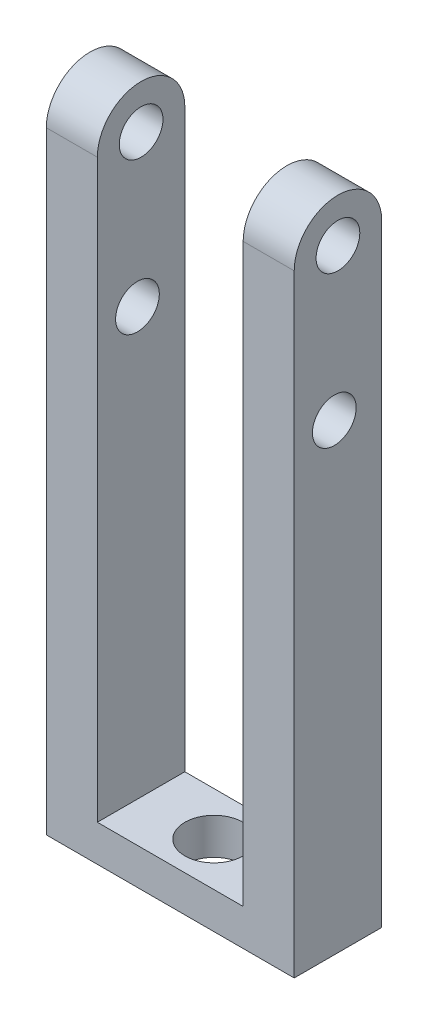
ISO-10303-21;
HEADER;
FILE_DESCRIPTION(('STEP AP214'),'2;1');
FILE_NAME('part.step','',(''),(''),'','','');
FILE_SCHEMA(('AUTOMOTIVE_DESIGN { 1 0 10303 214 1 1 1 1 }'));
ENDSEC;
DATA;
#1=APPLICATION_CONTEXT('core data for automotive mechanical design processes');
#2=APPLICATION_PROTOCOL_DEFINITION('international standard','automotive_design',2000,#1);
#3=PRODUCT_CONTEXT('',#1,'mechanical');
#4=PRODUCT('Part','Part','',(#3));
#5=PRODUCT_RELATED_PRODUCT_CATEGORY('part','',(#4));
#6=PRODUCT_DEFINITION_FORMATION('','',#4);
#7=PRODUCT_DEFINITION_CONTEXT('part definition',#1,'design');
#8=PRODUCT_DEFINITION('design','',#6,#7);
#9=PRODUCT_DEFINITION_SHAPE('','',#8);
#10=(LENGTH_UNIT() NAMED_UNIT(*) SI_UNIT(.MILLI.,.METRE.));
#11=(NAMED_UNIT(*) PLANE_ANGLE_UNIT() SI_UNIT($,.RADIAN.));
#12=(NAMED_UNIT(*) SI_UNIT($,.STERADIAN.) SOLID_ANGLE_UNIT());
#13=UNCERTAINTY_MEASURE_WITH_UNIT(LENGTH_MEASURE(1.E-05),#10,'distance_accuracy_value','');
#14=(GEOMETRIC_REPRESENTATION_CONTEXT(3) GLOBAL_UNCERTAINTY_ASSIGNED_CONTEXT((#13)) GLOBAL_UNIT_ASSIGNED_CONTEXT((#10,
#11,#12)) REPRESENTATION_CONTEXT('',''));
#15=CARTESIAN_POINT('',(0.,0.,0.));
#16=DIRECTION('',(0.,0.,1.));
#17=DIRECTION('',(1.,0.,0.));
#18=AXIS2_PLACEMENT_3D('',#15,#16,#17);
#19=CARTESIAN_POINT('',(17.,5.,6.));
#20=DIRECTION('',(-1.,0.,0.));
#21=DIRECTION('',(0.,0.,1.));
#22=AXIS2_PLACEMENT_3D('',#19,#20,#21);
#23=PLANE('',#22);
#24=DIRECTION('',(0.,0.,-1.));
#25=VECTOR('',#24,1.);
#26=CARTESIAN_POINT('',(17.,0.,6.));
#27=LINE('',#26,#25);
#28=CARTESIAN_POINT('',(17.,0.,6.));
#29=VERTEX_POINT('',#28);
#30=CARTESIAN_POINT('',(17.,0.,-6.));
#31=VERTEX_POINT('',#30);
#32=EDGE_CURVE('E192',#29,#31,#27,.T.);
#33=ORIENTED_EDGE('',*,*,#32,.T.);
#34=DIRECTION('',(0.,-1.,0.));
#35=VECTOR('',#34,1.);
#36=CARTESIAN_POINT('',(17.,5.,-6.));
#37=LINE('',#36,#35);
#38=CARTESIAN_POINT('',(17.,84.,-6.));
#39=VERTEX_POINT('',#38);
#40=EDGE_CURVE('E11',#39,#31,#37,.T.);
#41=ORIENTED_EDGE('',*,*,#40,.F.);
#42=CARTESIAN_POINT('',(17.,84.,0.));
#43=DIRECTION('',(1.,0.,0.));
#44=DIRECTION('',(0.,0.,1.));
#45=AXIS2_PLACEMENT_3D('',#42,#43,#44);
#46=CIRCLE('',#45,6.);
#47=CARTESIAN_POINT('',(17.,84.,6.));
#48=VERTEX_POINT('',#47);
#49=EDGE_CURVE('E166',#39,#48,#46,.T.);
#50=ORIENTED_EDGE('',*,*,#49,.T.);
#51=DIRECTION('',(0.,-1.,0.));
#52=VECTOR('',#51,1.);
#53=CARTESIAN_POINT('',(17.,5.,6.));
#54=LINE('',#53,#52);
#55=EDGE_CURVE('E201',#48,#29,#54,.T.);
#56=ORIENTED_EDGE('',*,*,#55,.T.);
#57=EDGE_LOOP('',(#33,#41,#50,#56));
#58=FACE_BOUND('',#57,.T.);
#59=CARTESIAN_POINT('',(17.,63.5,0.5));
#60=DIRECTION('',(1.,0.,0.));
#61=DIRECTION('',(0.,0.,-1.));
#62=AXIS2_PLACEMENT_3D('',#59,#60,#61);
#63=CIRCLE('',#62,3.);
#64=CARTESIAN_POINT('',(17.,63.5,-2.5));
#65=VERTEX_POINT('',#64);
#66=EDGE_CURVE('E150',#65,#65,#63,.T.);
#67=ORIENTED_EDGE('',*,*,#66,.F.);
#68=EDGE_LOOP('',(#67));
#69=FACE_BOUND('',#68,.T.);
#70=CARTESIAN_POINT('',(17.,84.,0.));
#71=DIRECTION('',(1.,0.,0.));
#72=DIRECTION('',(0.,0.,-1.));
#73=AXIS2_PLACEMENT_3D('',#70,#71,#72);
#74=CIRCLE('',#73,3.);
#75=CARTESIAN_POINT('',(17.,84.,-3.00000000000001));
#76=VERTEX_POINT('',#75);
#77=EDGE_CURVE('E158',#76,#76,#74,.T.);
#78=ORIENTED_EDGE('',*,*,#77,.F.);
#79=EDGE_LOOP('',(#78));
#80=FACE_BOUND('',#79,.T.);
#81=ADVANCED_FACE('F39',(#58,#69,#80),#23,.F.);
#82=CARTESIAN_POINT('',(-17.,5.,-6.));
#83=DIRECTION('',(0.,0.,1.));
#84=DIRECTION('',(1.,0.,0.));
#85=AXIS2_PLACEMENT_3D('',#82,#83,#84);
#86=PLANE('',#85);
#87=DIRECTION('',(-1.,0.,0.));
#88=VECTOR('',#87,1.);
#89=CARTESIAN_POINT('',(-17.,0.,-6.));
#90=LINE('',#89,#88);
#91=CARTESIAN_POINT('',(-17.,0.,-6.));
#92=VERTEX_POINT('',#91);
#93=EDGE_CURVE('E205',#31,#92,#90,.T.);
#94=ORIENTED_EDGE('',*,*,#93,.T.);
#95=DIRECTION('',(0.,-1.,0.));
#96=VECTOR('',#95,1.);
#97=CARTESIAN_POINT('',(-17.,5.,-6.));
#98=LINE('',#97,#96);
#99=CARTESIAN_POINT('',(-17.,84.,-6.));
#100=VERTEX_POINT('',#99);
#101=EDGE_CURVE('E47',#100,#92,#98,.T.);
#102=ORIENTED_EDGE('',*,*,#101,.F.);
#103=DIRECTION('',(-1.,0.,0.));
#104=VECTOR('',#103,1.);
#105=CARTESIAN_POINT('',(-10.,84.,-6.));
#106=LINE('',#105,#104);
#107=CARTESIAN_POINT('',(-10.,84.,-6.));
#108=VERTEX_POINT('',#107);
#109=EDGE_CURVE('E125',#108,#100,#106,.T.);
#110=ORIENTED_EDGE('',*,*,#109,.F.);
#111=DIRECTION('',(0.,1.,0.));
#112=VECTOR('',#111,1.);
#113=CARTESIAN_POINT('',(-10.,5.,-6.));
#114=LINE('',#113,#112);
#115=CARTESIAN_POINT('',(-10.,5.,-6.));
#116=VERTEX_POINT('',#115);
#117=EDGE_CURVE('E110',#116,#108,#114,.T.);
#118=ORIENTED_EDGE('',*,*,#117,.F.);
#119=DIRECTION('',(-1.,0.,0.));
#120=VECTOR('',#119,1.);
#121=CARTESIAN_POINT('',(-17.,5.,-6.));
#122=LINE('',#121,#120);
#123=CARTESIAN_POINT('',(10.,5.,-6.));
#124=VERTEX_POINT('',#123);
#125=EDGE_CURVE('E54',#124,#116,#122,.T.);
#126=ORIENTED_EDGE('',*,*,#125,.F.);
#127=DIRECTION('',(0.,1.,0.));
#128=VECTOR('',#127,1.);
#129=CARTESIAN_POINT('',(10.,5.,-6.));
#130=LINE('',#129,#128);
#131=CARTESIAN_POINT('',(10.,84.,-6.));
#132=VERTEX_POINT('',#131);
#133=EDGE_CURVE('E176',#124,#132,#130,.T.);
#134=ORIENTED_EDGE('',*,*,#133,.T.);
#135=DIRECTION('',(1.,0.,0.));
#136=VECTOR('',#135,1.);
#137=CARTESIAN_POINT('',(10.,84.,-6.));
#138=LINE('',#137,#136);
#139=EDGE_CURVE('E184',#132,#39,#138,.T.);
#140=ORIENTED_EDGE('',*,*,#139,.T.);
#141=ORIENTED_EDGE('',*,*,#40,.T.);
#142=EDGE_LOOP('',(#94,#102,#110,#118,#126,#134,#140,#141));
#143=FACE_BOUND('',#142,.T.);
#144=ADVANCED_FACE('F240',(#143),#86,.F.);
#145=CARTESIAN_POINT('',(-17.,5.,6.));
#146=DIRECTION('',(1.,0.,0.));
#147=DIRECTION('',(0.,0.,-1.));
#148=AXIS2_PLACEMENT_3D('',#145,#146,#147);
#149=PLANE('',#148);
#150=DIRECTION('',(0.,0.,1.));
#151=VECTOR('',#150,1.);
#152=CARTESIAN_POINT('',(-17.,0.,6.));
#153=LINE('',#152,#151);
#154=CARTESIAN_POINT('',(-17.,0.,6.));
#155=VERTEX_POINT('',#154);
#156=EDGE_CURVE('E208',#92,#155,#153,.T.);
#157=ORIENTED_EDGE('',*,*,#156,.T.);
#158=DIRECTION('',(0.,-1.,0.));
#159=VECTOR('',#158,1.);
#160=CARTESIAN_POINT('',(-17.,5.,6.));
#161=LINE('',#160,#159);
#162=CARTESIAN_POINT('',(-17.,84.,6.));
#163=VERTEX_POINT('',#162);
#164=EDGE_CURVE('E216',#163,#155,#161,.T.);
#165=ORIENTED_EDGE('',*,*,#164,.F.);
#166=CARTESIAN_POINT('',(-17.,84.,0.));
#167=DIRECTION('',(1.,0.,0.));
#168=DIRECTION('',(0.,0.,1.));
#169=AXIS2_PLACEMENT_3D('',#166,#167,#168);
#170=CIRCLE('',#169,6.);
#171=EDGE_CURVE('E121',#100,#163,#170,.T.);
#172=ORIENTED_EDGE('',*,*,#171,.F.);
#173=ORIENTED_EDGE('',*,*,#101,.T.);
#174=EDGE_LOOP('',(#157,#165,#172,#173));
#175=FACE_BOUND('',#174,.T.);
#176=CARTESIAN_POINT('',(-17.,84.,0.));
#177=DIRECTION('',(1.,0.,0.));
#178=DIRECTION('',(0.,0.,-1.));
#179=AXIS2_PLACEMENT_3D('',#176,#177,#178);
#180=CIRCLE('',#179,3.);
#181=CARTESIAN_POINT('',(-17.,84.,-3.00000000000001));
#182=VERTEX_POINT('',#181);
#183=EDGE_CURVE('E136',#182,#182,#180,.T.);
#184=ORIENTED_EDGE('',*,*,#183,.T.);
#185=EDGE_LOOP('',(#184));
#186=FACE_BOUND('',#185,.T.);
#187=CARTESIAN_POINT('',(-17.,63.5,0.5));
#188=DIRECTION('',(1.,0.,0.));
#189=DIRECTION('',(0.,0.,-1.));
#190=AXIS2_PLACEMENT_3D('',#187,#188,#189);
#191=CIRCLE('',#190,3.);
#192=CARTESIAN_POINT('',(-17.,63.5,-2.5));
#193=VERTEX_POINT('',#192);
#194=EDGE_CURVE('E293',#193,#193,#191,.T.);
#195=ORIENTED_EDGE('',*,*,#194,.T.);
#196=EDGE_LOOP('',(#195));
#197=FACE_BOUND('',#196,.T.);
#198=ADVANCED_FACE('F222',(#175,#186,#197),#149,.F.);
#199=CARTESIAN_POINT('',(-17.,5.,6.));
#200=DIRECTION('',(0.,0.,-1.));
#201=DIRECTION('',(-1.,0.,0.));
#202=AXIS2_PLACEMENT_3D('',#199,#200,#201);
#203=PLANE('',#202);
#204=DIRECTION('',(1.,0.,0.));
#205=VECTOR('',#204,1.);
#206=CARTESIAN_POINT('',(-17.,0.,6.));
#207=LINE('',#206,#205);
#208=EDGE_CURVE('E198',#155,#29,#207,.T.);
#209=ORIENTED_EDGE('',*,*,#208,.T.);
#210=ORIENTED_EDGE('',*,*,#55,.F.);
#211=DIRECTION('',(1.,0.,0.));
#212=VECTOR('',#211,1.);
#213=CARTESIAN_POINT('',(10.,84.,6.));
#214=LINE('',#213,#212);
#215=CARTESIAN_POINT('',(10.,84.,6.));
#216=VERTEX_POINT('',#215);
#217=EDGE_CURVE('E188',#216,#48,#214,.T.);
#218=ORIENTED_EDGE('',*,*,#217,.F.);
#219=DIRECTION('',(0.,-1.,0.));
#220=VECTOR('',#219,1.);
#221=CARTESIAN_POINT('',(10.,5.,6.));
#222=LINE('',#221,#220);
#223=CARTESIAN_POINT('',(10.,5.,6.));
#224=VERTEX_POINT('',#223);
#225=EDGE_CURVE('E170',#216,#224,#222,.T.);
#226=ORIENTED_EDGE('',*,*,#225,.T.);
#227=DIRECTION('',(1.,0.,0.));
#228=VECTOR('',#227,1.);
#229=CARTESIAN_POINT('',(-17.,5.,6.));
#230=LINE('',#229,#228);
#231=CARTESIAN_POINT('',(-10.,5.,6.));
#232=VERTEX_POINT('',#231);
#233=EDGE_CURVE('E129',#232,#224,#230,.T.);
#234=ORIENTED_EDGE('',*,*,#233,.F.);
#235=DIRECTION('',(0.,-1.,0.));
#236=VECTOR('',#235,1.);
#237=CARTESIAN_POINT('',(-10.,5.,6.));
#238=LINE('',#237,#236);
#239=CARTESIAN_POINT('',(-10.,84.,6.));
#240=VERTEX_POINT('',#239);
#241=EDGE_CURVE('E108',#240,#232,#238,.T.);
#242=ORIENTED_EDGE('',*,*,#241,.F.);
#243=DIRECTION('',(-1.,0.,0.));
#244=VECTOR('',#243,1.);
#245=CARTESIAN_POINT('',(-10.,84.,6.));
#246=LINE('',#245,#244);
#247=EDGE_CURVE('E118',#240,#163,#246,.T.);
#248=ORIENTED_EDGE('',*,*,#247,.T.);
#249=ORIENTED_EDGE('',*,*,#164,.T.);
#250=EDGE_LOOP('',(#209,#210,#218,#226,#234,#242,#248,#249));
#251=FACE_BOUND('',#250,.T.);
#252=ADVANCED_FACE('F127',(#251),#203,.F.);
#253=CARTESIAN_POINT('',(0.,5.,0.));
#254=DIRECTION('',(0.,-1.,0.));
#255=DIRECTION('',(0.,0.,-1.));
#256=AXIS2_PLACEMENT_3D('',#253,#254,#255);
#257=PLANE('',#256);
#258=CARTESIAN_POINT('',(0.,5.,0.));
#259=DIRECTION('',(0.,1.,0.));
#260=DIRECTION('',(0.,0.,1.));
#261=AXIS2_PLACEMENT_3D('',#258,#259,#260);
#262=CIRCLE('',#261,4.);
#263=CARTESIAN_POINT('',(0.,5.,4.));
#264=VERTEX_POINT('',#263);
#265=EDGE_CURVE('E144',#264,#264,#262,.T.);
#266=ORIENTED_EDGE('',*,*,#265,.F.);
#267=EDGE_LOOP('',(#266));
#268=FACE_BOUND('',#267,.T.);
#269=ORIENTED_EDGE('',*,*,#125,.T.);
#270=DIRECTION('',(0.,0.,-1.));
#271=VECTOR('',#270,1.);
#272=CARTESIAN_POINT('',(-10.,5.,6.));
#273=LINE('',#272,#271);
#274=EDGE_CURVE('E58',#232,#116,#273,.T.);
#275=ORIENTED_EDGE('',*,*,#274,.F.);
#276=ORIENTED_EDGE('',*,*,#233,.T.);
#277=DIRECTION('',(0.,0.,-1.));
#278=VECTOR('',#277,1.);
#279=CARTESIAN_POINT('',(10.,5.,6.));
#280=LINE('',#279,#278);
#281=EDGE_CURVE('E173',#224,#124,#280,.T.);
#282=ORIENTED_EDGE('',*,*,#281,.T.);
#283=EDGE_LOOP('',(#269,#275,#276,#282));
#284=FACE_BOUND('',#283,.T.);
#285=ADVANCED_FACE('F239',(#268,#284),#257,.F.);
#286=CARTESIAN_POINT('',(0.,0.,0.));
#287=DIRECTION('',(0.,-1.,0.));
#288=DIRECTION('',(0.,0.,-1.));
#289=AXIS2_PLACEMENT_3D('',#286,#287,#288);
#290=PLANE('',#289);
#291=CARTESIAN_POINT('',(0.,0.,0.));
#292=DIRECTION('',(0.,1.,0.));
#293=DIRECTION('',(0.,0.,1.));
#294=AXIS2_PLACEMENT_3D('',#291,#292,#293);
#295=CIRCLE('',#294,4.);
#296=CARTESIAN_POINT('',(0.,0.,4.));
#297=VERTEX_POINT('',#296);
#298=EDGE_CURVE('E146',#297,#297,#295,.T.);
#299=ORIENTED_EDGE('',*,*,#298,.T.);
#300=EDGE_LOOP('',(#299));
#301=FACE_BOUND('',#300,.T.);
#302=ORIENTED_EDGE('',*,*,#32,.F.);
#303=ORIENTED_EDGE('',*,*,#208,.F.);
#304=ORIENTED_EDGE('',*,*,#156,.F.);
#305=ORIENTED_EDGE('',*,*,#93,.F.);
#306=EDGE_LOOP('',(#302,#303,#304,#305));
#307=FACE_BOUND('',#306,.T.);
#308=ADVANCED_FACE('F228',(#301,#307),#290,.T.);
#309=CARTESIAN_POINT('',(10.,84.,0.));
#310=DIRECTION('',(1.,0.,0.));
#311=DIRECTION('',(0.,0.,-1.));
#312=AXIS2_PLACEMENT_3D('',#309,#310,#311);
#313=CYLINDRICAL_SURFACE('',#312,6.);
#314=ORIENTED_EDGE('',*,*,#49,.F.);
#315=ORIENTED_EDGE('',*,*,#139,.F.);
#316=CARTESIAN_POINT('',(10.,84.,0.));
#317=DIRECTION('',(1.,0.,0.));
#318=DIRECTION('',(0.,0.,1.));
#319=AXIS2_PLACEMENT_3D('',#316,#317,#318);
#320=CIRCLE('',#319,6.);
#321=EDGE_CURVE('E180',#132,#216,#320,.T.);
#322=ORIENTED_EDGE('',*,*,#321,.T.);
#323=ORIENTED_EDGE('',*,*,#217,.T.);
#324=EDGE_LOOP('',(#314,#315,#322,#323));
#325=FACE_BOUND('',#324,.T.);
#326=ADVANCED_FACE('F233',(#325),#313,.T.);
#327=CARTESIAN_POINT('',(10.,84.,0.));
#328=DIRECTION('',(-1.,0.,0.));
#329=DIRECTION('',(0.,0.,1.));
#330=AXIS2_PLACEMENT_3D('',#327,#328,#329);
#331=PLANE('',#330);
#332=CARTESIAN_POINT('',(10.,63.5,0.5));
#333=DIRECTION('',(1.,0.,0.));
#334=DIRECTION('',(0.,0.,-1.));
#335=AXIS2_PLACEMENT_3D('',#332,#333,#334);
#336=CIRCLE('',#335,3.);
#337=CARTESIAN_POINT('',(10.,63.5,-2.5));
#338=VERTEX_POINT('',#337);
#339=EDGE_CURVE('E154',#338,#338,#336,.T.);
#340=ORIENTED_EDGE('',*,*,#339,.T.);
#341=EDGE_LOOP('',(#340));
#342=FACE_BOUND('',#341,.T.);
#343=CARTESIAN_POINT('',(10.,84.,0.));
#344=DIRECTION('',(1.,0.,0.));
#345=DIRECTION('',(0.,0.,-1.));
#346=AXIS2_PLACEMENT_3D('',#343,#344,#345);
#347=CIRCLE('',#346,3.);
#348=CARTESIAN_POINT('',(10.,84.,-3.00000000000001));
#349=VERTEX_POINT('',#348);
#350=EDGE_CURVE('E162',#349,#349,#347,.T.);
#351=ORIENTED_EDGE('',*,*,#350,.T.);
#352=EDGE_LOOP('',(#351));
#353=FACE_BOUND('',#352,.T.);
#354=ORIENTED_EDGE('',*,*,#225,.F.);
#355=ORIENTED_EDGE('',*,*,#321,.F.);
#356=ORIENTED_EDGE('',*,*,#133,.F.);
#357=ORIENTED_EDGE('',*,*,#281,.F.);
#358=EDGE_LOOP('',(#354,#355,#356,#357));
#359=FACE_BOUND('',#358,.T.);
#360=ADVANCED_FACE('F238',(#342,#353,#359),#331,.T.);
#361=CARTESIAN_POINT('',(10.,84.,0.));
#362=DIRECTION('',(1.,0.,0.));
#363=DIRECTION('',(0.,0.,-1.));
#364=AXIS2_PLACEMENT_3D('',#361,#362,#363);
#365=CYLINDRICAL_SURFACE('',#364,3.);
#366=ORIENTED_EDGE('',*,*,#350,.F.);
#367=EDGE_LOOP('',(#366));
#368=FACE_BOUND('',#367,.T.);
#369=ORIENTED_EDGE('',*,*,#77,.T.);
#370=EDGE_LOOP('',(#369));
#371=FACE_BOUND('',#370,.T.);
#372=ADVANCED_FACE('F260',(#368,#371),#365,.F.);
#373=CARTESIAN_POINT('',(10.,63.5,0.5));
#374=DIRECTION('',(1.,0.,0.));
#375=DIRECTION('',(0.,0.,-1.));
#376=AXIS2_PLACEMENT_3D('',#373,#374,#375);
#377=CYLINDRICAL_SURFACE('',#376,3.);
#378=ORIENTED_EDGE('',*,*,#339,.F.);
#379=EDGE_LOOP('',(#378));
#380=FACE_BOUND('',#379,.T.);
#381=ORIENTED_EDGE('',*,*,#66,.T.);
#382=EDGE_LOOP('',(#381));
#383=FACE_BOUND('',#382,.T.);
#384=ADVANCED_FACE('F264',(#380,#383),#377,.F.);
#385=CARTESIAN_POINT('',(0.,0.,0.));
#386=DIRECTION('',(0.,1.,0.));
#387=DIRECTION('',(0.,0.,1.));
#388=AXIS2_PLACEMENT_3D('',#385,#386,#387);
#389=CYLINDRICAL_SURFACE('',#388,4.);
#390=ORIENTED_EDGE('',*,*,#298,.F.);
#391=EDGE_LOOP('',(#390));
#392=FACE_BOUND('',#391,.T.);
#393=ORIENTED_EDGE('',*,*,#265,.T.);
#394=EDGE_LOOP('',(#393));
#395=FACE_BOUND('',#394,.T.);
#396=ADVANCED_FACE('F268',(#392,#395),#389,.F.);
#397=CARTESIAN_POINT('',(-10.,84.,0.));
#398=DIRECTION('',(1.,0.,0.));
#399=DIRECTION('',(0.,0.,1.));
#400=AXIS2_PLACEMENT_3D('',#397,#398,#399);
#401=PLANE('',#400);
#402=CARTESIAN_POINT('',(-10.,84.,0.));
#403=DIRECTION('',(1.,0.,0.));
#404=DIRECTION('',(0.,0.,-1.));
#405=AXIS2_PLACEMENT_3D('',#402,#403,#404);
#406=CIRCLE('',#405,3.);
#407=CARTESIAN_POINT('',(-10.,84.,-3.00000000000001));
#408=VERTEX_POINT('',#407);
#409=EDGE_CURVE('E133',#408,#408,#406,.T.);
#410=ORIENTED_EDGE('',*,*,#409,.F.);
#411=EDGE_LOOP('',(#410));
#412=FACE_BOUND('',#411,.T.);
#413=ORIENTED_EDGE('',*,*,#241,.T.);
#414=ORIENTED_EDGE('',*,*,#274,.T.);
#415=ORIENTED_EDGE('',*,*,#117,.T.);
#416=CARTESIAN_POINT('',(-10.,84.,0.));
#417=DIRECTION('',(1.,0.,0.));
#418=DIRECTION('',(0.,0.,1.));
#419=AXIS2_PLACEMENT_3D('',#416,#417,#418);
#420=CIRCLE('',#419,6.);
#421=EDGE_CURVE('E103',#108,#240,#420,.T.);
#422=ORIENTED_EDGE('',*,*,#421,.T.);
#423=EDGE_LOOP('',(#413,#414,#415,#422));
#424=FACE_BOUND('',#423,.T.);
#425=CARTESIAN_POINT('',(-10.,63.5,0.5));
#426=DIRECTION('',(1.,0.,0.));
#427=DIRECTION('',(0.,0.,-1.));
#428=AXIS2_PLACEMENT_3D('',#425,#426,#427);
#429=CIRCLE('',#428,3.);
#430=CARTESIAN_POINT('',(-10.,63.5,-2.5));
#431=VERTEX_POINT('',#430);
#432=EDGE_CURVE('E290',#431,#431,#429,.T.);
#433=ORIENTED_EDGE('',*,*,#432,.F.);
#434=EDGE_LOOP('',(#433));
#435=FACE_BOUND('',#434,.T.);
#436=ADVANCED_FACE('F105',(#412,#424,#435),#401,.T.);
#437=CARTESIAN_POINT('',(-10.,84.,0.));
#438=DIRECTION('',(-1.,0.,0.));
#439=DIRECTION('',(0.,0.,1.));
#440=AXIS2_PLACEMENT_3D('',#437,#438,#439);
#441=CYLINDRICAL_SURFACE('',#440,6.);
#442=ORIENTED_EDGE('',*,*,#171,.T.);
#443=ORIENTED_EDGE('',*,*,#247,.F.);
#444=ORIENTED_EDGE('',*,*,#421,.F.);
#445=ORIENTED_EDGE('',*,*,#109,.T.);
#446=EDGE_LOOP('',(#442,#443,#444,#445));
#447=FACE_BOUND('',#446,.T.);
#448=ADVANCED_FACE('F119',(#447),#441,.T.);
#449=CARTESIAN_POINT('',(-10.,84.,0.));
#450=DIRECTION('',(-1.,0.,0.));
#451=DIRECTION('',(0.,0.,1.));
#452=AXIS2_PLACEMENT_3D('',#449,#450,#451);
#453=CYLINDRICAL_SURFACE('',#452,3.);
#454=ORIENTED_EDGE('',*,*,#409,.T.);
#455=EDGE_LOOP('',(#454));
#456=FACE_BOUND('',#455,.T.);
#457=ORIENTED_EDGE('',*,*,#183,.F.);
#458=EDGE_LOOP('',(#457));
#459=FACE_BOUND('',#458,.T.);
#460=ADVANCED_FACE('F275',(#456,#459),#453,.F.);
#461=CARTESIAN_POINT('',(-10.,63.5,0.5));
#462=DIRECTION('',(-1.,0.,0.));
#463=DIRECTION('',(0.,0.,1.));
#464=AXIS2_PLACEMENT_3D('',#461,#462,#463);
#465=CYLINDRICAL_SURFACE('',#464,3.);
#466=ORIENTED_EDGE('',*,*,#432,.T.);
#467=EDGE_LOOP('',(#466));
#468=FACE_BOUND('',#467,.T.);
#469=ORIENTED_EDGE('',*,*,#194,.F.);
#470=EDGE_LOOP('',(#469));
#471=FACE_BOUND('',#470,.T.);
#472=ADVANCED_FACE('F281',(#468,#471),#465,.F.);
#473=CLOSED_SHELL('',(#81,#144,#198,#252,#285,#308,#326,#360,#372,#384,#396,#436,#448,#460,#472));
#474=MANIFOLD_SOLID_BREP('B2',#473);
#475=ADVANCED_BREP_SHAPE_REPRESENTATION('',(#18,#474),#14);
#476=SHAPE_DEFINITION_REPRESENTATION(#9,#475);
ENDSEC;
END-ISO-10303-21;
